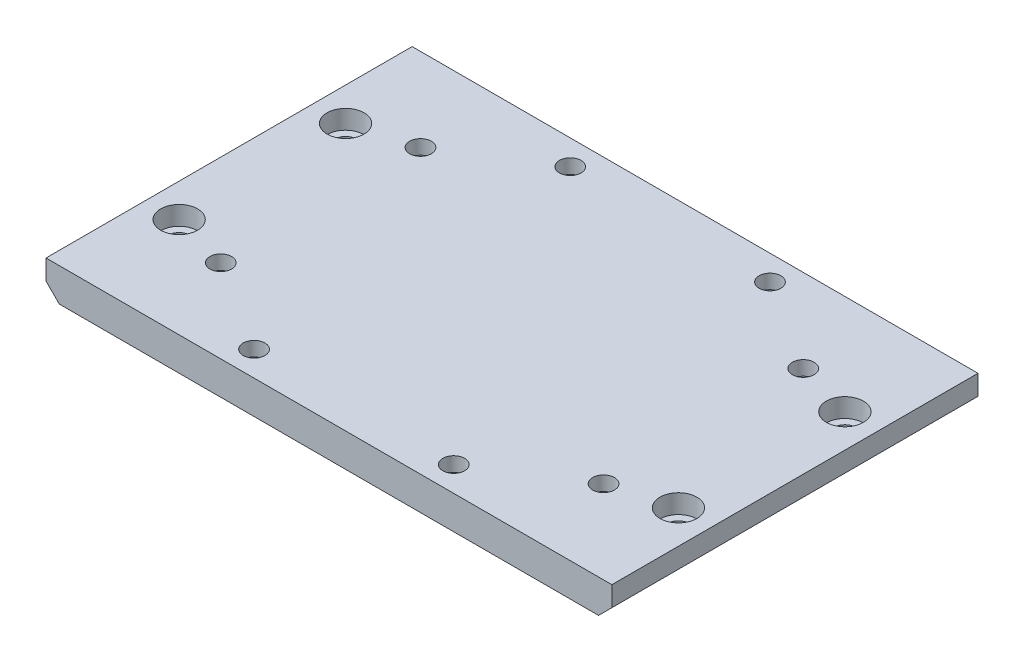
ISO-10303-21;
HEADER;
FILE_DESCRIPTION(('STEP AP214'),'2;1');
FILE_NAME('part.step','',(''),(''),'','','');
FILE_SCHEMA(('AUTOMOTIVE_DESIGN { 1 0 10303 214 1 1 1 1 }'));
ENDSEC;
DATA;
#1=APPLICATION_CONTEXT('core data for automotive mechanical design processes');
#2=APPLICATION_PROTOCOL_DEFINITION('international standard','automotive_design',2000,#1);
#3=PRODUCT_CONTEXT('',#1,'mechanical');
#4=PRODUCT('Part','Part','',(#3));
#5=PRODUCT_RELATED_PRODUCT_CATEGORY('part','',(#4));
#6=PRODUCT_DEFINITION_FORMATION('','',#4);
#7=PRODUCT_DEFINITION_CONTEXT('part definition',#1,'design');
#8=PRODUCT_DEFINITION('design','',#6,#7);
#9=PRODUCT_DEFINITION_SHAPE('','',#8);
#10=(LENGTH_UNIT() NAMED_UNIT(*) SI_UNIT(.MILLI.,.METRE.));
#11=(NAMED_UNIT(*) PLANE_ANGLE_UNIT() SI_UNIT($,.RADIAN.));
#12=(NAMED_UNIT(*) SI_UNIT($,.STERADIAN.) SOLID_ANGLE_UNIT());
#13=UNCERTAINTY_MEASURE_WITH_UNIT(LENGTH_MEASURE(1.E-05),#10,'distance_accuracy_value','');
#14=(GEOMETRIC_REPRESENTATION_CONTEXT(3) GLOBAL_UNCERTAINTY_ASSIGNED_CONTEXT((#13)) GLOBAL_UNIT_ASSIGNED_CONTEXT((#10,
#11,#12)) REPRESENTATION_CONTEXT('',''));
#15=CARTESIAN_POINT('',(0.,0.,0.));
#16=DIRECTION('',(0.,0.,1.));
#17=DIRECTION('',(1.,0.,0.));
#18=AXIS2_PLACEMENT_3D('',#15,#16,#17);
#19=CARTESIAN_POINT('',(27.5,5.,27.5));
#20=DIRECTION('',(0.,0.,-1.));
#21=DIRECTION('',(-1.,0.,0.));
#22=AXIS2_PLACEMENT_3D('',#19,#20,#21);
#23=PLANE('',#22);
#24=DIRECTION('',(0.,-1.,0.));
#25=VECTOR('',#24,1.);
#26=CARTESIAN_POINT('',(-42.5,62.0087712549569,27.5));
#27=LINE('',#26,#25);
#28=CARTESIAN_POINT('',(-42.5,5.,27.5));
#29=VERTEX_POINT('',#28);
#30=CARTESIAN_POINT('',(-42.5,2.,27.5));
#31=VERTEX_POINT('',#30);
#32=EDGE_CURVE('E124',#29,#31,#27,.T.);
#33=ORIENTED_EDGE('',*,*,#32,.T.);
#34=DIRECTION('',(0.707106781186548,-0.707106781186548,0.));
#35=VECTOR('',#34,1.);
#36=CARTESIAN_POINT('',(-40.5,0.,27.5));
#37=LINE('',#36,#35);
#38=CARTESIAN_POINT('',(-40.5,0.,27.5));
#39=VERTEX_POINT('',#38);
#40=EDGE_CURVE('E46',#31,#39,#37,.T.);
#41=ORIENTED_EDGE('',*,*,#40,.T.);
#42=DIRECTION('',(1.,0.,0.));
#43=VECTOR('',#42,1.);
#44=CARTESIAN_POINT('',(27.5,0.,27.5));
#45=LINE('',#44,#43);
#46=CARTESIAN_POINT('',(40.5,0.,27.5));
#47=VERTEX_POINT('',#46);
#48=EDGE_CURVE('E126',#39,#47,#45,.T.);
#49=ORIENTED_EDGE('',*,*,#48,.T.);
#50=DIRECTION('',(0.707106781186547,0.707106781186548,0.));
#51=VECTOR('',#50,1.);
#52=CARTESIAN_POINT('',(40.5,0.,27.5));
#53=LINE('',#52,#51);
#54=CARTESIAN_POINT('',(42.5,2.00000000000002,27.5));
#55=VERTEX_POINT('',#54);
#56=EDGE_CURVE('E53',#47,#55,#53,.T.);
#57=ORIENTED_EDGE('',*,*,#56,.T.);
#58=DIRECTION('',(0.,-1.,0.));
#59=VECTOR('',#58,1.);
#60=CARTESIAN_POINT('',(42.5,62.0087712549569,27.5));
#61=LINE('',#60,#59);
#62=CARTESIAN_POINT('',(42.5,5.,27.5));
#63=VERTEX_POINT('',#62);
#64=EDGE_CURVE('E111',#63,#55,#61,.T.);
#65=ORIENTED_EDGE('',*,*,#64,.F.);
#66=DIRECTION('',(1.,0.,0.));
#67=VECTOR('',#66,1.);
#68=CARTESIAN_POINT('',(27.5,5.,27.5));
#69=LINE('',#68,#67);
#70=EDGE_CURVE('E105',#29,#63,#69,.T.);
#71=ORIENTED_EDGE('',*,*,#70,.F.);
#72=EDGE_LOOP('',(#33,#41,#49,#57,#65,#71));
#73=FACE_BOUND('',#72,.T.);
#74=ADVANCED_FACE('F37',(#73),#23,.F.);
#75=CARTESIAN_POINT('',(27.5,5.,-27.5));
#76=DIRECTION('',(0.,0.,1.));
#77=DIRECTION('',(1.,0.,0.));
#78=AXIS2_PLACEMENT_3D('',#75,#76,#77);
#79=PLANE('',#78);
#80=DIRECTION('',(-1.,0.,0.));
#81=VECTOR('',#80,1.);
#82=CARTESIAN_POINT('',(27.5,0.,-27.5));
#83=LINE('',#82,#81);
#84=CARTESIAN_POINT('',(40.5,0.,-27.5));
#85=VERTEX_POINT('',#84);
#86=CARTESIAN_POINT('',(-40.5,0.,-27.5));
#87=VERTEX_POINT('',#86);
#88=EDGE_CURVE('E128',#85,#87,#83,.T.);
#89=ORIENTED_EDGE('',*,*,#88,.T.);
#90=DIRECTION('',(-0.707106781186548,0.707106781186548,0.));
#91=VECTOR('',#90,1.);
#92=CARTESIAN_POINT('',(-40.5,0.,-27.5));
#93=LINE('',#92,#91);
#94=CARTESIAN_POINT('',(-42.5,2.,-27.5));
#95=VERTEX_POINT('',#94);
#96=EDGE_CURVE('E139',#87,#95,#93,.T.);
#97=ORIENTED_EDGE('',*,*,#96,.T.);
#98=DIRECTION('',(0.,-1.,0.));
#99=VECTOR('',#98,1.);
#100=CARTESIAN_POINT('',(-42.5,62.0087712549569,-27.5));
#101=LINE('',#100,#99);
#102=CARTESIAN_POINT('',(-42.5,5.,-27.5));
#103=VERTEX_POINT('',#102);
#104=EDGE_CURVE('E100',#103,#95,#101,.T.);
#105=ORIENTED_EDGE('',*,*,#104,.F.);
#106=DIRECTION('',(-1.,0.,0.));
#107=VECTOR('',#106,1.);
#108=CARTESIAN_POINT('',(27.5,5.,-27.5));
#109=LINE('',#108,#107);
#110=CARTESIAN_POINT('',(42.5,5.,-27.5));
#111=VERTEX_POINT('',#110);
#112=EDGE_CURVE('E93',#111,#103,#109,.T.);
#113=ORIENTED_EDGE('',*,*,#112,.F.);
#114=DIRECTION('',(0.,-1.,0.));
#115=VECTOR('',#114,1.);
#116=CARTESIAN_POINT('',(42.5,62.0087712549569,-27.5));
#117=LINE('',#116,#115);
#118=CARTESIAN_POINT('',(42.5,2.00000000000002,-27.5));
#119=VERTEX_POINT('',#118);
#120=EDGE_CURVE('E98',#111,#119,#117,.T.);
#121=ORIENTED_EDGE('',*,*,#120,.T.);
#122=DIRECTION('',(-0.707106781186547,-0.707106781186548,0.));
#123=VECTOR('',#122,1.);
#124=CARTESIAN_POINT('',(40.5,0.,-27.5));
#125=LINE('',#124,#123);
#126=EDGE_CURVE('E137',#119,#85,#125,.T.);
#127=ORIENTED_EDGE('',*,*,#126,.T.);
#128=EDGE_LOOP('',(#89,#97,#105,#113,#121,#127));
#129=FACE_BOUND('',#128,.T.);
#130=ADVANCED_FACE('F96',(#129),#79,.F.);
#131=CARTESIAN_POINT('',(0.,5.,0.));
#132=DIRECTION('',(0.,1.,0.));
#133=DIRECTION('',(0.,0.,1.));
#134=AXIS2_PLACEMENT_3D('',#131,#132,#133);
#135=PLANE('',#134);
#136=CARTESIAN_POINT('',(28.75,5.,-15.));
#137=DIRECTION('',(0.,-1.,0.));
#138=DIRECTION('',(0.,0.,-1.));
#139=AXIS2_PLACEMENT_3D('',#136,#137,#138);
#140=CIRCLE('',#139,1.63195);
#141=CARTESIAN_POINT('',(28.75,5.,-16.63195));
#142=VERTEX_POINT('',#141);
#143=EDGE_CURVE('E459',#142,#142,#140,.T.);
#144=ORIENTED_EDGE('',*,*,#143,.T.);
#145=EDGE_LOOP('',(#144));
#146=FACE_BOUND('',#145,.T.);
#147=CARTESIAN_POINT('',(15.,5.,-23.75));
#148=DIRECTION('',(0.,-1.,0.));
#149=DIRECTION('',(0.,0.,-1.));
#150=AXIS2_PLACEMENT_3D('',#147,#148,#149);
#151=CIRCLE('',#150,1.63195);
#152=CARTESIAN_POINT('',(15.,5.,-25.38195));
#153=VERTEX_POINT('',#152);
#154=EDGE_CURVE('E447',#153,#153,#151,.T.);
#155=ORIENTED_EDGE('',*,*,#154,.T.);
#156=EDGE_LOOP('',(#155));
#157=FACE_BOUND('',#156,.T.);
#158=CARTESIAN_POINT('',(28.75,5.,15.));
#159=DIRECTION('',(0.,-1.,0.));
#160=DIRECTION('',(0.,0.,-1.));
#161=AXIS2_PLACEMENT_3D('',#158,#159,#160);
#162=CIRCLE('',#161,1.63195);
#163=CARTESIAN_POINT('',(28.75,5.,13.36805));
#164=VERTEX_POINT('',#163);
#165=EDGE_CURVE('E435',#164,#164,#162,.T.);
#166=ORIENTED_EDGE('',*,*,#165,.T.);
#167=EDGE_LOOP('',(#166));
#168=FACE_BOUND('',#167,.T.);
#169=CARTESIAN_POINT('',(15.,5.,23.75));
#170=DIRECTION('',(0.,-1.,0.));
#171=DIRECTION('',(0.,0.,-1.));
#172=AXIS2_PLACEMENT_3D('',#169,#170,#171);
#173=CIRCLE('',#172,1.63195);
#174=CARTESIAN_POINT('',(15.,5.,22.11805));
#175=VERTEX_POINT('',#174);
#176=EDGE_CURVE('E423',#175,#175,#173,.T.);
#177=ORIENTED_EDGE('',*,*,#176,.T.);
#178=EDGE_LOOP('',(#177));
#179=FACE_BOUND('',#178,.T.);
#180=CARTESIAN_POINT('',(-15.,5.,23.75));
#181=DIRECTION('',(0.,-1.,0.));
#182=DIRECTION('',(0.,0.,-1.));
#183=AXIS2_PLACEMENT_3D('',#180,#181,#182);
#184=CIRCLE('',#183,1.63195);
#185=CARTESIAN_POINT('',(-15.,5.,22.11805));
#186=VERTEX_POINT('',#185);
#187=EDGE_CURVE('E411',#186,#186,#184,.T.);
#188=ORIENTED_EDGE('',*,*,#187,.T.);
#189=EDGE_LOOP('',(#188));
#190=FACE_BOUND('',#189,.T.);
#191=CARTESIAN_POINT('',(-28.75,5.,15.));
#192=DIRECTION('',(0.,-1.,0.));
#193=DIRECTION('',(0.,0.,-1.));
#194=AXIS2_PLACEMENT_3D('',#191,#192,#193);
#195=CIRCLE('',#194,1.63195);
#196=CARTESIAN_POINT('',(-28.75,5.,13.36805));
#197=VERTEX_POINT('',#196);
#198=EDGE_CURVE('E399',#197,#197,#195,.T.);
#199=ORIENTED_EDGE('',*,*,#198,.T.);
#200=EDGE_LOOP('',(#199));
#201=FACE_BOUND('',#200,.T.);
#202=CARTESIAN_POINT('',(-28.75,5.,-15.));
#203=DIRECTION('',(0.,-1.,0.));
#204=DIRECTION('',(0.,0.,-1.));
#205=AXIS2_PLACEMENT_3D('',#202,#203,#204);
#206=CIRCLE('',#205,1.63195);
#207=CARTESIAN_POINT('',(-28.75,5.,-16.63195));
#208=VERTEX_POINT('',#207);
#209=EDGE_CURVE('E387',#208,#208,#206,.T.);
#210=ORIENTED_EDGE('',*,*,#209,.T.);
#211=EDGE_LOOP('',(#210));
#212=FACE_BOUND('',#211,.T.);
#213=CARTESIAN_POINT('',(-15.,5.,-23.75));
#214=DIRECTION('',(0.,-1.,0.));
#215=DIRECTION('',(0.,0.,-1.));
#216=AXIS2_PLACEMENT_3D('',#213,#214,#215);
#217=CIRCLE('',#216,1.63195);
#218=CARTESIAN_POINT('',(-15.,5.,-25.38195));
#219=VERTEX_POINT('',#218);
#220=EDGE_CURVE('E375',#219,#219,#217,.T.);
#221=ORIENTED_EDGE('',*,*,#220,.T.);
#222=EDGE_LOOP('',(#221));
#223=FACE_BOUND('',#222,.T.);
#224=CARTESIAN_POINT('',(-37.5,5.,-12.5));
#225=DIRECTION('',(0.,1.,0.));
#226=DIRECTION('',(0.,0.,1.));
#227=AXIS2_PLACEMENT_3D('',#224,#225,#226);
#228=CIRCLE('',#227,2.77875999999999);
#229=CARTESIAN_POINT('',(-37.5,5.,-9.72124));
#230=VERTEX_POINT('',#229);
#231=EDGE_CURVE('E372',#230,#230,#228,.T.);
#232=ORIENTED_EDGE('',*,*,#231,.F.);
#233=EDGE_LOOP('',(#232));
#234=FACE_BOUND('',#233,.T.);
#235=CARTESIAN_POINT('',(-37.5,5.,12.5));
#236=DIRECTION('',(0.,1.,0.));
#237=DIRECTION('',(0.,0.,1.));
#238=AXIS2_PLACEMENT_3D('',#235,#236,#237);
#239=CIRCLE('',#238,2.77875999999999);
#240=CARTESIAN_POINT('',(-37.5,5.,15.27876));
#241=VERTEX_POINT('',#240);
#242=EDGE_CURVE('E360',#241,#241,#239,.T.);
#243=ORIENTED_EDGE('',*,*,#242,.F.);
#244=EDGE_LOOP('',(#243));
#245=FACE_BOUND('',#244,.T.);
#246=CARTESIAN_POINT('',(37.5,5.,12.5));
#247=DIRECTION('',(0.,1.,0.));
#248=DIRECTION('',(0.,0.,1.));
#249=AXIS2_PLACEMENT_3D('',#246,#247,#248);
#250=CIRCLE('',#249,2.77875999999999);
#251=CARTESIAN_POINT('',(37.5,5.,15.27876));
#252=VERTEX_POINT('',#251);
#253=EDGE_CURVE('E348',#252,#252,#250,.T.);
#254=ORIENTED_EDGE('',*,*,#253,.F.);
#255=EDGE_LOOP('',(#254));
#256=FACE_BOUND('',#255,.T.);
#257=CARTESIAN_POINT('',(37.5,5.,-12.5));
#258=DIRECTION('',(0.,1.,0.));
#259=DIRECTION('',(0.,0.,1.));
#260=AXIS2_PLACEMENT_3D('',#257,#258,#259);
#261=CIRCLE('',#260,2.77875999999999);
#262=CARTESIAN_POINT('',(37.5,5.,-9.72124000000001));
#263=VERTEX_POINT('',#262);
#264=EDGE_CURVE('E334',#263,#263,#261,.T.);
#265=ORIENTED_EDGE('',*,*,#264,.F.);
#266=EDGE_LOOP('',(#265));
#267=FACE_BOUND('',#266,.T.);
#268=ORIENTED_EDGE('',*,*,#112,.T.);
#269=DIRECTION('',(0.,0.,-1.));
#270=VECTOR('',#269,1.);
#271=CARTESIAN_POINT('',(-42.5,5.,27.5));
#272=LINE('',#271,#270);
#273=EDGE_CURVE('E122',#29,#103,#272,.T.);
#274=ORIENTED_EDGE('',*,*,#273,.F.);
#275=ORIENTED_EDGE('',*,*,#70,.T.);
#276=DIRECTION('',(0.,0.,1.));
#277=VECTOR('',#276,1.);
#278=CARTESIAN_POINT('',(42.5,5.,27.5));
#279=LINE('',#278,#277);
#280=EDGE_CURVE('E108',#111,#63,#279,.T.);
#281=ORIENTED_EDGE('',*,*,#280,.F.);
#282=EDGE_LOOP('',(#268,#274,#275,#281));
#283=FACE_BOUND('',#282,.T.);
#284=ADVANCED_FACE('F109',(#146,#157,#168,#179,#190,#201,#212,#223,#234,#245,#256,#267,#283),
#135,.T.);
#285=CARTESIAN_POINT('',(0.,0.,0.));
#286=DIRECTION('',(0.,1.,0.));
#287=DIRECTION('',(0.,0.,1.));
#288=AXIS2_PLACEMENT_3D('',#285,#286,#287);
#289=PLANE('',#288);
#290=CARTESIAN_POINT('',(28.75,0.,-15.));
#291=DIRECTION('',(0.,-1.,0.));
#292=DIRECTION('',(0.,0.,-1.));
#293=AXIS2_PLACEMENT_3D('',#290,#291,#292);
#294=CIRCLE('',#293,2.77876);
#295=CARTESIAN_POINT('',(28.75,0.,-17.77876));
#296=VERTEX_POINT('',#295);
#297=EDGE_CURVE('E468',#296,#296,#294,.T.);
#298=ORIENTED_EDGE('',*,*,#297,.F.);
#299=EDGE_LOOP('',(#298));
#300=FACE_BOUND('',#299,.T.);
#301=CARTESIAN_POINT('',(15.,0.,-23.75));
#302=DIRECTION('',(0.,-1.,0.));
#303=DIRECTION('',(0.,0.,-1.));
#304=AXIS2_PLACEMENT_3D('',#301,#302,#303);
#305=CIRCLE('',#304,2.77876);
#306=CARTESIAN_POINT('',(15.,0.,-26.52876));
#307=VERTEX_POINT('',#306);
#308=EDGE_CURVE('E456',#307,#307,#305,.T.);
#309=ORIENTED_EDGE('',*,*,#308,.F.);
#310=EDGE_LOOP('',(#309));
#311=FACE_BOUND('',#310,.T.);
#312=CARTESIAN_POINT('',(28.75,0.,15.));
#313=DIRECTION('',(0.,-1.,0.));
#314=DIRECTION('',(0.,0.,-1.));
#315=AXIS2_PLACEMENT_3D('',#312,#313,#314);
#316=CIRCLE('',#315,2.77876);
#317=CARTESIAN_POINT('',(28.75,0.,12.22124));
#318=VERTEX_POINT('',#317);
#319=EDGE_CURVE('E444',#318,#318,#316,.T.);
#320=ORIENTED_EDGE('',*,*,#319,.F.);
#321=EDGE_LOOP('',(#320));
#322=FACE_BOUND('',#321,.T.);
#323=CARTESIAN_POINT('',(15.,0.,23.75));
#324=DIRECTION('',(0.,-1.,0.));
#325=DIRECTION('',(0.,0.,-1.));
#326=AXIS2_PLACEMENT_3D('',#323,#324,#325);
#327=CIRCLE('',#326,2.77876);
#328=CARTESIAN_POINT('',(15.,0.,20.97124));
#329=VERTEX_POINT('',#328);
#330=EDGE_CURVE('E432',#329,#329,#327,.T.);
#331=ORIENTED_EDGE('',*,*,#330,.F.);
#332=EDGE_LOOP('',(#331));
#333=FACE_BOUND('',#332,.T.);
#334=CARTESIAN_POINT('',(-15.,0.,23.75));
#335=DIRECTION('',(0.,-1.,0.));
#336=DIRECTION('',(0.,0.,-1.));
#337=AXIS2_PLACEMENT_3D('',#334,#335,#336);
#338=CIRCLE('',#337,2.77876);
#339=CARTESIAN_POINT('',(-15.,0.,20.97124));
#340=VERTEX_POINT('',#339);
#341=EDGE_CURVE('E420',#340,#340,#338,.T.);
#342=ORIENTED_EDGE('',*,*,#341,.F.);
#343=EDGE_LOOP('',(#342));
#344=FACE_BOUND('',#343,.T.);
#345=CARTESIAN_POINT('',(-28.75,0.,15.));
#346=DIRECTION('',(0.,-1.,0.));
#347=DIRECTION('',(0.,0.,-1.));
#348=AXIS2_PLACEMENT_3D('',#345,#346,#347);
#349=CIRCLE('',#348,2.77876);
#350=CARTESIAN_POINT('',(-28.75,0.,12.22124));
#351=VERTEX_POINT('',#350);
#352=EDGE_CURVE('E408',#351,#351,#349,.T.);
#353=ORIENTED_EDGE('',*,*,#352,.F.);
#354=EDGE_LOOP('',(#353));
#355=FACE_BOUND('',#354,.T.);
#356=CARTESIAN_POINT('',(-28.75,0.,-15.));
#357=DIRECTION('',(0.,-1.,0.));
#358=DIRECTION('',(0.,0.,-1.));
#359=AXIS2_PLACEMENT_3D('',#356,#357,#358);
#360=CIRCLE('',#359,2.77876);
#361=CARTESIAN_POINT('',(-28.75,0.,-17.77876));
#362=VERTEX_POINT('',#361);
#363=EDGE_CURVE('E396',#362,#362,#360,.T.);
#364=ORIENTED_EDGE('',*,*,#363,.F.);
#365=EDGE_LOOP('',(#364));
#366=FACE_BOUND('',#365,.T.);
#367=CARTESIAN_POINT('',(-15.,0.,-23.75));
#368=DIRECTION('',(0.,-1.,0.));
#369=DIRECTION('',(0.,0.,-1.));
#370=AXIS2_PLACEMENT_3D('',#367,#368,#369);
#371=CIRCLE('',#370,2.77876);
#372=CARTESIAN_POINT('',(-15.,0.,-26.52876));
#373=VERTEX_POINT('',#372);
#374=EDGE_CURVE('E384',#373,#373,#371,.T.);
#375=ORIENTED_EDGE('',*,*,#374,.F.);
#376=EDGE_LOOP('',(#375));
#377=FACE_BOUND('',#376,.T.);
#378=CARTESIAN_POINT('',(-37.5,0.,-12.5));
#379=DIRECTION('',(0.,1.,0.));
#380=DIRECTION('',(0.,0.,1.));
#381=AXIS2_PLACEMENT_3D('',#378,#379,#380);
#382=CIRCLE('',#381,1.63195000000001);
#383=CARTESIAN_POINT('',(-37.5,0.,-10.86805));
#384=VERTEX_POINT('',#383);
#385=EDGE_CURVE('E363',#384,#384,#382,.T.);
#386=ORIENTED_EDGE('',*,*,#385,.T.);
#387=EDGE_LOOP('',(#386));
#388=FACE_BOUND('',#387,.T.);
#389=CARTESIAN_POINT('',(-37.5,0.,12.5));
#390=DIRECTION('',(0.,1.,0.));
#391=DIRECTION('',(0.,0.,1.));
#392=AXIS2_PLACEMENT_3D('',#389,#390,#391);
#393=CIRCLE('',#392,1.63195000000001);
#394=CARTESIAN_POINT('',(-37.5,0.,14.13195));
#395=VERTEX_POINT('',#394);
#396=EDGE_CURVE('E351',#395,#395,#393,.T.);
#397=ORIENTED_EDGE('',*,*,#396,.T.);
#398=EDGE_LOOP('',(#397));
#399=FACE_BOUND('',#398,.T.);
#400=CARTESIAN_POINT('',(37.5,0.,12.5));
#401=DIRECTION('',(0.,1.,0.));
#402=DIRECTION('',(0.,0.,1.));
#403=AXIS2_PLACEMENT_3D('',#400,#401,#402);
#404=CIRCLE('',#403,1.63195000000001);
#405=CARTESIAN_POINT('',(37.5,0.,14.13195));
#406=VERTEX_POINT('',#405);
#407=EDGE_CURVE('E339',#406,#406,#404,.T.);
#408=ORIENTED_EDGE('',*,*,#407,.T.);
#409=EDGE_LOOP('',(#408));
#410=FACE_BOUND('',#409,.T.);
#411=CARTESIAN_POINT('',(37.5,0.,-12.5));
#412=DIRECTION('',(0.,1.,0.));
#413=DIRECTION('',(0.,0.,1.));
#414=AXIS2_PLACEMENT_3D('',#411,#412,#413);
#415=CIRCLE('',#414,1.63195000000001);
#416=CARTESIAN_POINT('',(37.5,0.,-10.86805));
#417=VERTEX_POINT('',#416);
#418=EDGE_CURVE('E115',#417,#417,#415,.T.);
#419=ORIENTED_EDGE('',*,*,#418,.T.);
#420=EDGE_LOOP('',(#419));
#421=FACE_BOUND('',#420,.T.);
#422=ORIENTED_EDGE('',*,*,#48,.F.);
#423=DIRECTION('',(0.,0.,-1.));
#424=VECTOR('',#423,1.);
#425=CARTESIAN_POINT('',(-40.5,0.,-27.5));
#426=LINE('',#425,#424);
#427=EDGE_CURVE('E134',#39,#87,#426,.T.);
#428=ORIENTED_EDGE('',*,*,#427,.T.);
#429=ORIENTED_EDGE('',*,*,#88,.F.);
#430=DIRECTION('',(0.,0.,1.));
#431=VECTOR('',#430,1.);
#432=CARTESIAN_POINT('',(40.5,0.,27.5));
#433=LINE('',#432,#431);
#434=EDGE_CURVE('E104',#85,#47,#433,.T.);
#435=ORIENTED_EDGE('',*,*,#434,.T.);
#436=EDGE_LOOP('',(#422,#428,#429,#435));
#437=FACE_BOUND('',#436,.T.);
#438=ADVANCED_FACE('F147',(#300,#311,#322,#333,#344,#355,#366,#377,#388,#399,#410,#421,#437),
#289,.F.);
#439=CARTESIAN_POINT('',(-42.5,62.0087712549569,27.5));
#440=DIRECTION('',(-1.,0.,0.));
#441=DIRECTION('',(0.,0.,1.));
#442=AXIS2_PLACEMENT_3D('',#439,#440,#441);
#443=PLANE('',#442);
#444=ORIENTED_EDGE('',*,*,#104,.T.);
#445=DIRECTION('',(0.,0.,1.));
#446=VECTOR('',#445,1.);
#447=CARTESIAN_POINT('',(-42.5,2.,27.5));
#448=LINE('',#447,#446);
#449=EDGE_CURVE('E61',#95,#31,#448,.T.);
#450=ORIENTED_EDGE('',*,*,#449,.T.);
#451=ORIENTED_EDGE('',*,*,#32,.F.);
#452=ORIENTED_EDGE('',*,*,#273,.T.);
#453=EDGE_LOOP('',(#444,#450,#451,#452));
#454=FACE_BOUND('',#453,.T.);
#455=ADVANCED_FACE('F151',(#454),#443,.T.);
#456=CARTESIAN_POINT('',(42.5,62.0087712549569,27.5));
#457=DIRECTION('',(1.,0.,0.));
#458=DIRECTION('',(0.,0.,-1.));
#459=AXIS2_PLACEMENT_3D('',#456,#457,#458);
#460=PLANE('',#459);
#461=ORIENTED_EDGE('',*,*,#64,.T.);
#462=DIRECTION('',(0.,0.,-1.));
#463=VECTOR('',#462,1.);
#464=CARTESIAN_POINT('',(42.5,2.00000000000002,-27.5));
#465=LINE('',#464,#463);
#466=EDGE_CURVE('E11',#55,#119,#465,.T.);
#467=ORIENTED_EDGE('',*,*,#466,.T.);
#468=ORIENTED_EDGE('',*,*,#120,.F.);
#469=ORIENTED_EDGE('',*,*,#280,.T.);
#470=EDGE_LOOP('',(#461,#467,#468,#469));
#471=FACE_BOUND('',#470,.T.);
#472=ADVANCED_FACE('F113',(#471),#460,.T.);
#473=CARTESIAN_POINT('',(37.5,5.,-12.5));
#474=DIRECTION('',(0.,1.,0.));
#475=DIRECTION('',(0.,0.,1.));
#476=AXIS2_PLACEMENT_3D('',#473,#474,#475);
#477=CYLINDRICAL_SURFACE('',#476,1.63195000000001);
#478=ORIENTED_EDGE('',*,*,#418,.F.);
#479=EDGE_LOOP('',(#478));
#480=FACE_BOUND('',#479,.T.);
#481=CARTESIAN_POINT('',(37.5,2.1552,-12.5));
#482=DIRECTION('',(0.,1.,0.));
#483=DIRECTION('',(0.,0.,1.));
#484=AXIS2_PLACEMENT_3D('',#481,#482,#483);
#485=CIRCLE('',#484,1.63195000000001);
#486=CARTESIAN_POINT('',(37.5,2.1552,-10.86805));
#487=VERTEX_POINT('',#486);
#488=EDGE_CURVE('E118',#487,#487,#485,.T.);
#489=ORIENTED_EDGE('',*,*,#488,.T.);
#490=EDGE_LOOP('',(#489));
#491=FACE_BOUND('',#490,.T.);
#492=ADVANCED_FACE('F158',(#480,#491),#477,.F.);
#493=CARTESIAN_POINT('',(39.13195,2.1552,-12.5));
#494=DIRECTION('',(0.,-1.,0.));
#495=DIRECTION('',(0.,0.,-1.));
#496=AXIS2_PLACEMENT_3D('',#493,#494,#495);
#497=PLANE('',#496);
#498=ORIENTED_EDGE('',*,*,#488,.F.);
#499=EDGE_LOOP('',(#498));
#500=FACE_BOUND('',#499,.T.);
#501=CARTESIAN_POINT('',(37.5,2.1552,-12.5));
#502=DIRECTION('',(0.,1.,0.));
#503=DIRECTION('',(0.,0.,1.));
#504=AXIS2_PLACEMENT_3D('',#501,#502,#503);
#505=CIRCLE('',#504,2.77875999999999);
#506=CARTESIAN_POINT('',(37.5,2.1552,-9.72124000000001));
#507=VERTEX_POINT('',#506);
#508=EDGE_CURVE('E331',#507,#507,#505,.T.);
#509=ORIENTED_EDGE('',*,*,#508,.T.);
#510=EDGE_LOOP('',(#509));
#511=FACE_BOUND('',#510,.T.);
#512=ADVANCED_FACE('F317',(#500,#511),#497,.F.);
#513=CARTESIAN_POINT('',(37.5,5.,-12.5));
#514=DIRECTION('',(0.,1.,0.));
#515=DIRECTION('',(0.,0.,1.));
#516=AXIS2_PLACEMENT_3D('',#513,#514,#515);
#517=CYLINDRICAL_SURFACE('',#516,2.77875999999999);
#518=ORIENTED_EDGE('',*,*,#508,.F.);
#519=EDGE_LOOP('',(#518));
#520=FACE_BOUND('',#519,.T.);
#521=ORIENTED_EDGE('',*,*,#264,.T.);
#522=EDGE_LOOP('',(#521));
#523=FACE_BOUND('',#522,.T.);
#524=ADVANCED_FACE('F313',(#520,#523),#517,.F.);
#525=CARTESIAN_POINT('',(37.5,5.,12.5));
#526=DIRECTION('',(0.,1.,0.));
#527=DIRECTION('',(0.,0.,1.));
#528=AXIS2_PLACEMENT_3D('',#525,#526,#527);
#529=CYLINDRICAL_SURFACE('',#528,1.63195000000001);
#530=ORIENTED_EDGE('',*,*,#407,.F.);
#531=EDGE_LOOP('',(#530));
#532=FACE_BOUND('',#531,.T.);
#533=CARTESIAN_POINT('',(37.5,2.1552,12.5));
#534=DIRECTION('',(0.,1.,0.));
#535=DIRECTION('',(0.,0.,1.));
#536=AXIS2_PLACEMENT_3D('',#533,#534,#535);
#537=CIRCLE('',#536,1.63195000000001);
#538=CARTESIAN_POINT('',(37.5,2.1552,14.13195));
#539=VERTEX_POINT('',#538);
#540=EDGE_CURVE('E342',#539,#539,#537,.T.);
#541=ORIENTED_EDGE('',*,*,#540,.T.);
#542=EDGE_LOOP('',(#541));
#543=FACE_BOUND('',#542,.T.);
#544=ADVANCED_FACE('F309',(#532,#543),#529,.F.);
#545=CARTESIAN_POINT('',(39.13195,2.1552,12.5));
#546=DIRECTION('',(0.,-1.,0.));
#547=DIRECTION('',(0.,0.,-1.));
#548=AXIS2_PLACEMENT_3D('',#545,#546,#547);
#549=PLANE('',#548);
#550=ORIENTED_EDGE('',*,*,#540,.F.);
#551=EDGE_LOOP('',(#550));
#552=FACE_BOUND('',#551,.T.);
#553=CARTESIAN_POINT('',(37.5,2.1552,12.5));
#554=DIRECTION('',(0.,1.,0.));
#555=DIRECTION('',(0.,0.,1.));
#556=AXIS2_PLACEMENT_3D('',#553,#554,#555);
#557=CIRCLE('',#556,2.77875999999999);
#558=CARTESIAN_POINT('',(37.5,2.1552,15.27876));
#559=VERTEX_POINT('',#558);
#560=EDGE_CURVE('E345',#559,#559,#557,.T.);
#561=ORIENTED_EDGE('',*,*,#560,.T.);
#562=EDGE_LOOP('',(#561));
#563=FACE_BOUND('',#562,.T.);
#564=ADVANCED_FACE('F305',(#552,#563),#549,.F.);
#565=CARTESIAN_POINT('',(37.5,5.,12.5));
#566=DIRECTION('',(0.,1.,0.));
#567=DIRECTION('',(0.,0.,1.));
#568=AXIS2_PLACEMENT_3D('',#565,#566,#567);
#569=CYLINDRICAL_SURFACE('',#568,2.77875999999999);
#570=ORIENTED_EDGE('',*,*,#560,.F.);
#571=EDGE_LOOP('',(#570));
#572=FACE_BOUND('',#571,.T.);
#573=ORIENTED_EDGE('',*,*,#253,.T.);
#574=EDGE_LOOP('',(#573));
#575=FACE_BOUND('',#574,.T.);
#576=ADVANCED_FACE('F301',(#572,#575),#569,.F.);
#577=CARTESIAN_POINT('',(-37.5,5.,12.5));
#578=DIRECTION('',(0.,1.,0.));
#579=DIRECTION('',(0.,0.,1.));
#580=AXIS2_PLACEMENT_3D('',#577,#578,#579);
#581=CYLINDRICAL_SURFACE('',#580,1.63195000000001);
#582=ORIENTED_EDGE('',*,*,#396,.F.);
#583=EDGE_LOOP('',(#582));
#584=FACE_BOUND('',#583,.T.);
#585=CARTESIAN_POINT('',(-37.5,2.1552,12.5));
#586=DIRECTION('',(0.,1.,0.));
#587=DIRECTION('',(0.,0.,1.));
#588=AXIS2_PLACEMENT_3D('',#585,#586,#587);
#589=CIRCLE('',#588,1.63195000000001);
#590=CARTESIAN_POINT('',(-37.5,2.1552,14.13195));
#591=VERTEX_POINT('',#590);
#592=EDGE_CURVE('E354',#591,#591,#589,.T.);
#593=ORIENTED_EDGE('',*,*,#592,.T.);
#594=EDGE_LOOP('',(#593));
#595=FACE_BOUND('',#594,.T.);
#596=ADVANCED_FACE('F297',(#584,#595),#581,.F.);
#597=CARTESIAN_POINT('',(-35.86805,2.1552,12.5));
#598=DIRECTION('',(0.,-1.,0.));
#599=DIRECTION('',(0.,0.,-1.));
#600=AXIS2_PLACEMENT_3D('',#597,#598,#599);
#601=PLANE('',#600);
#602=ORIENTED_EDGE('',*,*,#592,.F.);
#603=EDGE_LOOP('',(#602));
#604=FACE_BOUND('',#603,.T.);
#605=CARTESIAN_POINT('',(-37.5,2.1552,12.5));
#606=DIRECTION('',(0.,1.,0.));
#607=DIRECTION('',(0.,0.,1.));
#608=AXIS2_PLACEMENT_3D('',#605,#606,#607);
#609=CIRCLE('',#608,2.77875999999999);
#610=CARTESIAN_POINT('',(-37.5,2.1552,15.27876));
#611=VERTEX_POINT('',#610);
#612=EDGE_CURVE('E357',#611,#611,#609,.T.);
#613=ORIENTED_EDGE('',*,*,#612,.T.);
#614=EDGE_LOOP('',(#613));
#615=FACE_BOUND('',#614,.T.);
#616=ADVANCED_FACE('F293',(#604,#615),#601,.F.);
#617=CARTESIAN_POINT('',(-37.5,5.,12.5));
#618=DIRECTION('',(0.,1.,0.));
#619=DIRECTION('',(0.,0.,1.));
#620=AXIS2_PLACEMENT_3D('',#617,#618,#619);
#621=CYLINDRICAL_SURFACE('',#620,2.77875999999999);
#622=ORIENTED_EDGE('',*,*,#612,.F.);
#623=EDGE_LOOP('',(#622));
#624=FACE_BOUND('',#623,.T.);
#625=ORIENTED_EDGE('',*,*,#242,.T.);
#626=EDGE_LOOP('',(#625));
#627=FACE_BOUND('',#626,.T.);
#628=ADVANCED_FACE('F289',(#624,#627),#621,.F.);
#629=CARTESIAN_POINT('',(-37.5,5.,-12.5));
#630=DIRECTION('',(0.,1.,0.));
#631=DIRECTION('',(0.,0.,1.));
#632=AXIS2_PLACEMENT_3D('',#629,#630,#631);
#633=CYLINDRICAL_SURFACE('',#632,1.63195000000001);
#634=ORIENTED_EDGE('',*,*,#385,.F.);
#635=EDGE_LOOP('',(#634));
#636=FACE_BOUND('',#635,.T.);
#637=CARTESIAN_POINT('',(-37.5,2.1552,-12.5));
#638=DIRECTION('',(0.,1.,0.));
#639=DIRECTION('',(0.,0.,1.));
#640=AXIS2_PLACEMENT_3D('',#637,#638,#639);
#641=CIRCLE('',#640,1.63195000000001);
#642=CARTESIAN_POINT('',(-37.5,2.1552,-10.86805));
#643=VERTEX_POINT('',#642);
#644=EDGE_CURVE('E366',#643,#643,#641,.T.);
#645=ORIENTED_EDGE('',*,*,#644,.T.);
#646=EDGE_LOOP('',(#645));
#647=FACE_BOUND('',#646,.T.);
#648=ADVANCED_FACE('F285',(#636,#647),#633,.F.);
#649=CARTESIAN_POINT('',(-35.86805,2.1552,-12.5));
#650=DIRECTION('',(0.,-1.,0.));
#651=DIRECTION('',(0.,0.,-1.));
#652=AXIS2_PLACEMENT_3D('',#649,#650,#651);
#653=PLANE('',#652);
#654=ORIENTED_EDGE('',*,*,#644,.F.);
#655=EDGE_LOOP('',(#654));
#656=FACE_BOUND('',#655,.T.);
#657=CARTESIAN_POINT('',(-37.5,2.1552,-12.5));
#658=DIRECTION('',(0.,1.,0.));
#659=DIRECTION('',(0.,0.,1.));
#660=AXIS2_PLACEMENT_3D('',#657,#658,#659);
#661=CIRCLE('',#660,2.77875999999999);
#662=CARTESIAN_POINT('',(-37.5,2.1552,-9.72124));
#663=VERTEX_POINT('',#662);
#664=EDGE_CURVE('E369',#663,#663,#661,.T.);
#665=ORIENTED_EDGE('',*,*,#664,.T.);
#666=EDGE_LOOP('',(#665));
#667=FACE_BOUND('',#666,.T.);
#668=ADVANCED_FACE('F281',(#656,#667),#653,.F.);
#669=CARTESIAN_POINT('',(-37.5,5.,-12.5));
#670=DIRECTION('',(0.,1.,0.));
#671=DIRECTION('',(0.,0.,1.));
#672=AXIS2_PLACEMENT_3D('',#669,#670,#671);
#673=CYLINDRICAL_SURFACE('',#672,2.77875999999999);
#674=ORIENTED_EDGE('',*,*,#664,.F.);
#675=EDGE_LOOP('',(#674));
#676=FACE_BOUND('',#675,.T.);
#677=ORIENTED_EDGE('',*,*,#231,.T.);
#678=EDGE_LOOP('',(#677));
#679=FACE_BOUND('',#678,.T.);
#680=ADVANCED_FACE('F277',(#676,#679),#673,.F.);
#681=CARTESIAN_POINT('',(-15.,0.,-23.75));
#682=DIRECTION('',(0.,-1.,0.));
#683=DIRECTION('',(0.,0.,-1.));
#684=AXIS2_PLACEMENT_3D('',#681,#682,#683);
#685=CYLINDRICAL_SURFACE('',#684,1.63195);
#686=ORIENTED_EDGE('',*,*,#220,.F.);
#687=EDGE_LOOP('',(#686));
#688=FACE_BOUND('',#687,.T.);
#689=CARTESIAN_POINT('',(-15.,2.8448,-23.75));
#690=DIRECTION('',(0.,-1.,0.));
#691=DIRECTION('',(0.,0.,-1.));
#692=AXIS2_PLACEMENT_3D('',#689,#690,#691);
#693=CIRCLE('',#692,1.63195);
#694=CARTESIAN_POINT('',(-15.,2.8448,-25.38195));
#695=VERTEX_POINT('',#694);
#696=EDGE_CURVE('E378',#695,#695,#693,.T.);
#697=ORIENTED_EDGE('',*,*,#696,.T.);
#698=EDGE_LOOP('',(#697));
#699=FACE_BOUND('',#698,.T.);
#700=ADVANCED_FACE('F273',(#688,#699),#685,.F.);
#701=CARTESIAN_POINT('',(-13.36805,2.8448,-23.75));
#702=DIRECTION('',(0.,1.,0.));
#703=DIRECTION('',(0.,0.,1.));
#704=AXIS2_PLACEMENT_3D('',#701,#702,#703);
#705=PLANE('',#704);
#706=ORIENTED_EDGE('',*,*,#696,.F.);
#707=EDGE_LOOP('',(#706));
#708=FACE_BOUND('',#707,.T.);
#709=CARTESIAN_POINT('',(-15.,2.8448,-23.75));
#710=DIRECTION('',(0.,-1.,0.));
#711=DIRECTION('',(0.,0.,-1.));
#712=AXIS2_PLACEMENT_3D('',#709,#710,#711);
#713=CIRCLE('',#712,2.77876);
#714=CARTESIAN_POINT('',(-15.,2.8448,-26.52876));
#715=VERTEX_POINT('',#714);
#716=EDGE_CURVE('E381',#715,#715,#713,.T.);
#717=ORIENTED_EDGE('',*,*,#716,.T.);
#718=EDGE_LOOP('',(#717));
#719=FACE_BOUND('',#718,.T.);
#720=ADVANCED_FACE('F269',(#708,#719),#705,.F.);
#721=CARTESIAN_POINT('',(-15.,0.,-23.75));
#722=DIRECTION('',(0.,-1.,0.));
#723=DIRECTION('',(0.,0.,-1.));
#724=AXIS2_PLACEMENT_3D('',#721,#722,#723);
#725=CYLINDRICAL_SURFACE('',#724,2.77876);
#726=ORIENTED_EDGE('',*,*,#716,.F.);
#727=EDGE_LOOP('',(#726));
#728=FACE_BOUND('',#727,.T.);
#729=ORIENTED_EDGE('',*,*,#374,.T.);
#730=EDGE_LOOP('',(#729));
#731=FACE_BOUND('',#730,.T.);
#732=ADVANCED_FACE('F265',(#728,#731),#725,.F.);
#733=CARTESIAN_POINT('',(-28.75,0.,-15.));
#734=DIRECTION('',(0.,-1.,0.));
#735=DIRECTION('',(0.,0.,-1.));
#736=AXIS2_PLACEMENT_3D('',#733,#734,#735);
#737=CYLINDRICAL_SURFACE('',#736,1.63195);
#738=ORIENTED_EDGE('',*,*,#209,.F.);
#739=EDGE_LOOP('',(#738));
#740=FACE_BOUND('',#739,.T.);
#741=CARTESIAN_POINT('',(-28.75,2.8448,-15.));
#742=DIRECTION('',(0.,-1.,0.));
#743=DIRECTION('',(0.,0.,-1.));
#744=AXIS2_PLACEMENT_3D('',#741,#742,#743);
#745=CIRCLE('',#744,1.63195);
#746=CARTESIAN_POINT('',(-28.75,2.8448,-16.63195));
#747=VERTEX_POINT('',#746);
#748=EDGE_CURVE('E390',#747,#747,#745,.T.);
#749=ORIENTED_EDGE('',*,*,#748,.T.);
#750=EDGE_LOOP('',(#749));
#751=FACE_BOUND('',#750,.T.);
#752=ADVANCED_FACE('F261',(#740,#751),#737,.F.);
#753=CARTESIAN_POINT('',(-27.11805,2.8448,-15.));
#754=DIRECTION('',(0.,1.,0.));
#755=DIRECTION('',(0.,0.,1.));
#756=AXIS2_PLACEMENT_3D('',#753,#754,#755);
#757=PLANE('',#756);
#758=ORIENTED_EDGE('',*,*,#748,.F.);
#759=EDGE_LOOP('',(#758));
#760=FACE_BOUND('',#759,.T.);
#761=CARTESIAN_POINT('',(-28.75,2.8448,-15.));
#762=DIRECTION('',(0.,-1.,0.));
#763=DIRECTION('',(0.,0.,-1.));
#764=AXIS2_PLACEMENT_3D('',#761,#762,#763);
#765=CIRCLE('',#764,2.77876);
#766=CARTESIAN_POINT('',(-28.75,2.8448,-17.77876));
#767=VERTEX_POINT('',#766);
#768=EDGE_CURVE('E393',#767,#767,#765,.T.);
#769=ORIENTED_EDGE('',*,*,#768,.T.);
#770=EDGE_LOOP('',(#769));
#771=FACE_BOUND('',#770,.T.);
#772=ADVANCED_FACE('F257',(#760,#771),#757,.F.);
#773=CARTESIAN_POINT('',(-28.75,0.,-15.));
#774=DIRECTION('',(0.,-1.,0.));
#775=DIRECTION('',(0.,0.,-1.));
#776=AXIS2_PLACEMENT_3D('',#773,#774,#775);
#777=CYLINDRICAL_SURFACE('',#776,2.77876);
#778=ORIENTED_EDGE('',*,*,#768,.F.);
#779=EDGE_LOOP('',(#778));
#780=FACE_BOUND('',#779,.T.);
#781=ORIENTED_EDGE('',*,*,#363,.T.);
#782=EDGE_LOOP('',(#781));
#783=FACE_BOUND('',#782,.T.);
#784=ADVANCED_FACE('F253',(#780,#783),#777,.F.);
#785=CARTESIAN_POINT('',(-28.75,0.,15.));
#786=DIRECTION('',(0.,-1.,0.));
#787=DIRECTION('',(0.,0.,-1.));
#788=AXIS2_PLACEMENT_3D('',#785,#786,#787);
#789=CYLINDRICAL_SURFACE('',#788,1.63195);
#790=ORIENTED_EDGE('',*,*,#198,.F.);
#791=EDGE_LOOP('',(#790));
#792=FACE_BOUND('',#791,.T.);
#793=CARTESIAN_POINT('',(-28.75,2.8448,15.));
#794=DIRECTION('',(0.,-1.,0.));
#795=DIRECTION('',(0.,0.,-1.));
#796=AXIS2_PLACEMENT_3D('',#793,#794,#795);
#797=CIRCLE('',#796,1.63195);
#798=CARTESIAN_POINT('',(-28.75,2.8448,13.36805));
#799=VERTEX_POINT('',#798);
#800=EDGE_CURVE('E402',#799,#799,#797,.T.);
#801=ORIENTED_EDGE('',*,*,#800,.T.);
#802=EDGE_LOOP('',(#801));
#803=FACE_BOUND('',#802,.T.);
#804=ADVANCED_FACE('F249',(#792,#803),#789,.F.);
#805=CARTESIAN_POINT('',(-27.11805,2.8448,15.));
#806=DIRECTION('',(0.,1.,0.));
#807=DIRECTION('',(0.,0.,1.));
#808=AXIS2_PLACEMENT_3D('',#805,#806,#807);
#809=PLANE('',#808);
#810=ORIENTED_EDGE('',*,*,#800,.F.);
#811=EDGE_LOOP('',(#810));
#812=FACE_BOUND('',#811,.T.);
#813=CARTESIAN_POINT('',(-28.75,2.8448,15.));
#814=DIRECTION('',(0.,-1.,0.));
#815=DIRECTION('',(0.,0.,-1.));
#816=AXIS2_PLACEMENT_3D('',#813,#814,#815);
#817=CIRCLE('',#816,2.77876);
#818=CARTESIAN_POINT('',(-28.75,2.8448,12.22124));
#819=VERTEX_POINT('',#818);
#820=EDGE_CURVE('E405',#819,#819,#817,.T.);
#821=ORIENTED_EDGE('',*,*,#820,.T.);
#822=EDGE_LOOP('',(#821));
#823=FACE_BOUND('',#822,.T.);
#824=ADVANCED_FACE('F245',(#812,#823),#809,.F.);
#825=CARTESIAN_POINT('',(-28.75,0.,15.));
#826=DIRECTION('',(0.,-1.,0.));
#827=DIRECTION('',(0.,0.,-1.));
#828=AXIS2_PLACEMENT_3D('',#825,#826,#827);
#829=CYLINDRICAL_SURFACE('',#828,2.77876);
#830=ORIENTED_EDGE('',*,*,#820,.F.);
#831=EDGE_LOOP('',(#830));
#832=FACE_BOUND('',#831,.T.);
#833=ORIENTED_EDGE('',*,*,#352,.T.);
#834=EDGE_LOOP('',(#833));
#835=FACE_BOUND('',#834,.T.);
#836=ADVANCED_FACE('F241',(#832,#835),#829,.F.);
#837=CARTESIAN_POINT('',(-15.,0.,23.75));
#838=DIRECTION('',(0.,-1.,0.));
#839=DIRECTION('',(0.,0.,-1.));
#840=AXIS2_PLACEMENT_3D('',#837,#838,#839);
#841=CYLINDRICAL_SURFACE('',#840,1.63195);
#842=ORIENTED_EDGE('',*,*,#187,.F.);
#843=EDGE_LOOP('',(#842));
#844=FACE_BOUND('',#843,.T.);
#845=CARTESIAN_POINT('',(-15.,2.8448,23.75));
#846=DIRECTION('',(0.,-1.,0.));
#847=DIRECTION('',(0.,0.,-1.));
#848=AXIS2_PLACEMENT_3D('',#845,#846,#847);
#849=CIRCLE('',#848,1.63195);
#850=CARTESIAN_POINT('',(-15.,2.8448,22.11805));
#851=VERTEX_POINT('',#850);
#852=EDGE_CURVE('E414',#851,#851,#849,.T.);
#853=ORIENTED_EDGE('',*,*,#852,.T.);
#854=EDGE_LOOP('',(#853));
#855=FACE_BOUND('',#854,.T.);
#856=ADVANCED_FACE('F237',(#844,#855),#841,.F.);
#857=CARTESIAN_POINT('',(-13.36805,2.8448,23.75));
#858=DIRECTION('',(0.,1.,0.));
#859=DIRECTION('',(0.,0.,1.));
#860=AXIS2_PLACEMENT_3D('',#857,#858,#859);
#861=PLANE('',#860);
#862=ORIENTED_EDGE('',*,*,#852,.F.);
#863=EDGE_LOOP('',(#862));
#864=FACE_BOUND('',#863,.T.);
#865=CARTESIAN_POINT('',(-15.,2.8448,23.75));
#866=DIRECTION('',(0.,-1.,0.));
#867=DIRECTION('',(0.,0.,-1.));
#868=AXIS2_PLACEMENT_3D('',#865,#866,#867);
#869=CIRCLE('',#868,2.77876);
#870=CARTESIAN_POINT('',(-15.,2.8448,20.97124));
#871=VERTEX_POINT('',#870);
#872=EDGE_CURVE('E417',#871,#871,#869,.T.);
#873=ORIENTED_EDGE('',*,*,#872,.T.);
#874=EDGE_LOOP('',(#873));
#875=FACE_BOUND('',#874,.T.);
#876=ADVANCED_FACE('F233',(#864,#875),#861,.F.);
#877=CARTESIAN_POINT('',(-15.,0.,23.75));
#878=DIRECTION('',(0.,-1.,0.));
#879=DIRECTION('',(0.,0.,-1.));
#880=AXIS2_PLACEMENT_3D('',#877,#878,#879);
#881=CYLINDRICAL_SURFACE('',#880,2.77876);
#882=ORIENTED_EDGE('',*,*,#872,.F.);
#883=EDGE_LOOP('',(#882));
#884=FACE_BOUND('',#883,.T.);
#885=ORIENTED_EDGE('',*,*,#341,.T.);
#886=EDGE_LOOP('',(#885));
#887=FACE_BOUND('',#886,.T.);
#888=ADVANCED_FACE('F229',(#884,#887),#881,.F.);
#889=CARTESIAN_POINT('',(15.,0.,23.75));
#890=DIRECTION('',(0.,-1.,0.));
#891=DIRECTION('',(0.,0.,-1.));
#892=AXIS2_PLACEMENT_3D('',#889,#890,#891);
#893=CYLINDRICAL_SURFACE('',#892,1.63195);
#894=ORIENTED_EDGE('',*,*,#176,.F.);
#895=EDGE_LOOP('',(#894));
#896=FACE_BOUND('',#895,.T.);
#897=CARTESIAN_POINT('',(15.,2.8448,23.75));
#898=DIRECTION('',(0.,-1.,0.));
#899=DIRECTION('',(0.,0.,-1.));
#900=AXIS2_PLACEMENT_3D('',#897,#898,#899);
#901=CIRCLE('',#900,1.63195);
#902=CARTESIAN_POINT('',(15.,2.8448,22.11805));
#903=VERTEX_POINT('',#902);
#904=EDGE_CURVE('E426',#903,#903,#901,.T.);
#905=ORIENTED_EDGE('',*,*,#904,.T.);
#906=EDGE_LOOP('',(#905));
#907=FACE_BOUND('',#906,.T.);
#908=ADVANCED_FACE('F225',(#896,#907),#893,.F.);
#909=CARTESIAN_POINT('',(16.63195,2.8448,23.75));
#910=DIRECTION('',(0.,1.,0.));
#911=DIRECTION('',(0.,0.,1.));
#912=AXIS2_PLACEMENT_3D('',#909,#910,#911);
#913=PLANE('',#912);
#914=ORIENTED_EDGE('',*,*,#904,.F.);
#915=EDGE_LOOP('',(#914));
#916=FACE_BOUND('',#915,.T.);
#917=CARTESIAN_POINT('',(15.,2.8448,23.75));
#918=DIRECTION('',(0.,-1.,0.));
#919=DIRECTION('',(0.,0.,-1.));
#920=AXIS2_PLACEMENT_3D('',#917,#918,#919);
#921=CIRCLE('',#920,2.77876);
#922=CARTESIAN_POINT('',(15.,2.8448,20.97124));
#923=VERTEX_POINT('',#922);
#924=EDGE_CURVE('E429',#923,#923,#921,.T.);
#925=ORIENTED_EDGE('',*,*,#924,.T.);
#926=EDGE_LOOP('',(#925));
#927=FACE_BOUND('',#926,.T.);
#928=ADVANCED_FACE('F221',(#916,#927),#913,.F.);
#929=CARTESIAN_POINT('',(15.,0.,23.75));
#930=DIRECTION('',(0.,-1.,0.));
#931=DIRECTION('',(0.,0.,-1.));
#932=AXIS2_PLACEMENT_3D('',#929,#930,#931);
#933=CYLINDRICAL_SURFACE('',#932,2.77876);
#934=ORIENTED_EDGE('',*,*,#924,.F.);
#935=EDGE_LOOP('',(#934));
#936=FACE_BOUND('',#935,.T.);
#937=ORIENTED_EDGE('',*,*,#330,.T.);
#938=EDGE_LOOP('',(#937));
#939=FACE_BOUND('',#938,.T.);
#940=ADVANCED_FACE('F217',(#936,#939),#933,.F.);
#941=CARTESIAN_POINT('',(28.75,0.,15.));
#942=DIRECTION('',(0.,-1.,0.));
#943=DIRECTION('',(0.,0.,-1.));
#944=AXIS2_PLACEMENT_3D('',#941,#942,#943);
#945=CYLINDRICAL_SURFACE('',#944,1.63195);
#946=ORIENTED_EDGE('',*,*,#165,.F.);
#947=EDGE_LOOP('',(#946));
#948=FACE_BOUND('',#947,.T.);
#949=CARTESIAN_POINT('',(28.75,2.8448,15.));
#950=DIRECTION('',(0.,-1.,0.));
#951=DIRECTION('',(0.,0.,-1.));
#952=AXIS2_PLACEMENT_3D('',#949,#950,#951);
#953=CIRCLE('',#952,1.63195);
#954=CARTESIAN_POINT('',(28.75,2.8448,13.36805));
#955=VERTEX_POINT('',#954);
#956=EDGE_CURVE('E438',#955,#955,#953,.T.);
#957=ORIENTED_EDGE('',*,*,#956,.T.);
#958=EDGE_LOOP('',(#957));
#959=FACE_BOUND('',#958,.T.);
#960=ADVANCED_FACE('F213',(#948,#959),#945,.F.);
#961=CARTESIAN_POINT('',(30.38195,2.8448,15.));
#962=DIRECTION('',(0.,1.,0.));
#963=DIRECTION('',(0.,0.,1.));
#964=AXIS2_PLACEMENT_3D('',#961,#962,#963);
#965=PLANE('',#964);
#966=ORIENTED_EDGE('',*,*,#956,.F.);
#967=EDGE_LOOP('',(#966));
#968=FACE_BOUND('',#967,.T.);
#969=CARTESIAN_POINT('',(28.75,2.8448,15.));
#970=DIRECTION('',(0.,-1.,0.));
#971=DIRECTION('',(0.,0.,-1.));
#972=AXIS2_PLACEMENT_3D('',#969,#970,#971);
#973=CIRCLE('',#972,2.77876);
#974=CARTESIAN_POINT('',(28.75,2.8448,12.22124));
#975=VERTEX_POINT('',#974);
#976=EDGE_CURVE('E441',#975,#975,#973,.T.);
#977=ORIENTED_EDGE('',*,*,#976,.T.);
#978=EDGE_LOOP('',(#977));
#979=FACE_BOUND('',#978,.T.);
#980=ADVANCED_FACE('F209',(#968,#979),#965,.F.);
#981=CARTESIAN_POINT('',(28.75,0.,15.));
#982=DIRECTION('',(0.,-1.,0.));
#983=DIRECTION('',(0.,0.,-1.));
#984=AXIS2_PLACEMENT_3D('',#981,#982,#983);
#985=CYLINDRICAL_SURFACE('',#984,2.77876);
#986=ORIENTED_EDGE('',*,*,#976,.F.);
#987=EDGE_LOOP('',(#986));
#988=FACE_BOUND('',#987,.T.);
#989=ORIENTED_EDGE('',*,*,#319,.T.);
#990=EDGE_LOOP('',(#989));
#991=FACE_BOUND('',#990,.T.);
#992=ADVANCED_FACE('F205',(#988,#991),#985,.F.);
#993=CARTESIAN_POINT('',(15.,0.,-23.75));
#994=DIRECTION('',(0.,-1.,0.));
#995=DIRECTION('',(0.,0.,-1.));
#996=AXIS2_PLACEMENT_3D('',#993,#994,#995);
#997=CYLINDRICAL_SURFACE('',#996,1.63195);
#998=ORIENTED_EDGE('',*,*,#154,.F.);
#999=EDGE_LOOP('',(#998));
#1000=FACE_BOUND('',#999,.T.);
#1001=CARTESIAN_POINT('',(15.,2.8448,-23.75));
#1002=DIRECTION('',(0.,-1.,0.));
#1003=DIRECTION('',(0.,0.,-1.));
#1004=AXIS2_PLACEMENT_3D('',#1001,#1002,#1003);
#1005=CIRCLE('',#1004,1.63195);
#1006=CARTESIAN_POINT('',(15.,2.8448,-25.38195));
#1007=VERTEX_POINT('',#1006);
#1008=EDGE_CURVE('E450',#1007,#1007,#1005,.T.);
#1009=ORIENTED_EDGE('',*,*,#1008,.T.);
#1010=EDGE_LOOP('',(#1009));
#1011=FACE_BOUND('',#1010,.T.);
#1012=ADVANCED_FACE('F201',(#1000,#1011),#997,.F.);
#1013=CARTESIAN_POINT('',(16.63195,2.8448,-23.75));
#1014=DIRECTION('',(0.,1.,0.));
#1015=DIRECTION('',(0.,0.,1.));
#1016=AXIS2_PLACEMENT_3D('',#1013,#1014,#1015);
#1017=PLANE('',#1016);
#1018=ORIENTED_EDGE('',*,*,#1008,.F.);
#1019=EDGE_LOOP('',(#1018));
#1020=FACE_BOUND('',#1019,.T.);
#1021=CARTESIAN_POINT('',(15.,2.8448,-23.75));
#1022=DIRECTION('',(0.,-1.,0.));
#1023=DIRECTION('',(0.,0.,-1.));
#1024=AXIS2_PLACEMENT_3D('',#1021,#1022,#1023);
#1025=CIRCLE('',#1024,2.77876);
#1026=CARTESIAN_POINT('',(15.,2.8448,-26.52876));
#1027=VERTEX_POINT('',#1026);
#1028=EDGE_CURVE('E453',#1027,#1027,#1025,.T.);
#1029=ORIENTED_EDGE('',*,*,#1028,.T.);
#1030=EDGE_LOOP('',(#1029));
#1031=FACE_BOUND('',#1030,.T.);
#1032=ADVANCED_FACE('F197',(#1020,#1031),#1017,.F.);
#1033=CARTESIAN_POINT('',(15.,0.,-23.75));
#1034=DIRECTION('',(0.,-1.,0.));
#1035=DIRECTION('',(0.,0.,-1.));
#1036=AXIS2_PLACEMENT_3D('',#1033,#1034,#1035);
#1037=CYLINDRICAL_SURFACE('',#1036,2.77876);
#1038=ORIENTED_EDGE('',*,*,#1028,.F.);
#1039=EDGE_LOOP('',(#1038));
#1040=FACE_BOUND('',#1039,.T.);
#1041=ORIENTED_EDGE('',*,*,#308,.T.);
#1042=EDGE_LOOP('',(#1041));
#1043=FACE_BOUND('',#1042,.T.);
#1044=ADVANCED_FACE('F193',(#1040,#1043),#1037,.F.);
#1045=CARTESIAN_POINT('',(28.75,0.,-15.));
#1046=DIRECTION('',(0.,-1.,0.));
#1047=DIRECTION('',(0.,0.,-1.));
#1048=AXIS2_PLACEMENT_3D('',#1045,#1046,#1047);
#1049=CYLINDRICAL_SURFACE('',#1048,1.63195);
#1050=ORIENTED_EDGE('',*,*,#143,.F.);
#1051=EDGE_LOOP('',(#1050));
#1052=FACE_BOUND('',#1051,.T.);
#1053=CARTESIAN_POINT('',(28.75,2.8448,-15.));
#1054=DIRECTION('',(0.,-1.,0.));
#1055=DIRECTION('',(0.,0.,-1.));
#1056=AXIS2_PLACEMENT_3D('',#1053,#1054,#1055);
#1057=CIRCLE('',#1056,1.63195);
#1058=CARTESIAN_POINT('',(28.75,2.8448,-16.63195));
#1059=VERTEX_POINT('',#1058);
#1060=EDGE_CURVE('E462',#1059,#1059,#1057,.T.);
#1061=ORIENTED_EDGE('',*,*,#1060,.T.);
#1062=EDGE_LOOP('',(#1061));
#1063=FACE_BOUND('',#1062,.T.);
#1064=ADVANCED_FACE('F185',(#1052,#1063),#1049,.F.);
#1065=CARTESIAN_POINT('',(30.38195,2.8448,-15.));
#1066=DIRECTION('',(0.,1.,0.));
#1067=DIRECTION('',(0.,0.,1.));
#1068=AXIS2_PLACEMENT_3D('',#1065,#1066,#1067);
#1069=PLANE('',#1068);
#1070=ORIENTED_EDGE('',*,*,#1060,.F.);
#1071=EDGE_LOOP('',(#1070));
#1072=FACE_BOUND('',#1071,.T.);
#1073=CARTESIAN_POINT('',(28.75,2.8448,-15.));
#1074=DIRECTION('',(0.,-1.,0.));
#1075=DIRECTION('',(0.,0.,-1.));
#1076=AXIS2_PLACEMENT_3D('',#1073,#1074,#1075);
#1077=CIRCLE('',#1076,2.77876);
#1078=CARTESIAN_POINT('',(28.75,2.8448,-17.77876));
#1079=VERTEX_POINT('',#1078);
#1080=EDGE_CURVE('E465',#1079,#1079,#1077,.T.);
#1081=ORIENTED_EDGE('',*,*,#1080,.T.);
#1082=EDGE_LOOP('',(#1081));
#1083=FACE_BOUND('',#1082,.T.);
#1084=ADVANCED_FACE('F180',(#1072,#1083),#1069,.F.);
#1085=CARTESIAN_POINT('',(28.75,0.,-15.));
#1086=DIRECTION('',(0.,-1.,0.));
#1087=DIRECTION('',(0.,0.,-1.));
#1088=AXIS2_PLACEMENT_3D('',#1085,#1086,#1087);
#1089=CYLINDRICAL_SURFACE('',#1088,2.77876);
#1090=ORIENTED_EDGE('',*,*,#1080,.F.);
#1091=EDGE_LOOP('',(#1090));
#1092=FACE_BOUND('',#1091,.T.);
#1093=ORIENTED_EDGE('',*,*,#297,.T.);
#1094=EDGE_LOOP('',(#1093));
#1095=FACE_BOUND('',#1094,.T.);
#1096=ADVANCED_FACE('F174',(#1092,#1095),#1089,.F.);
#1097=CARTESIAN_POINT('',(-40.5,0.,0.));
#1098=DIRECTION('',(-0.707106781186547,-0.707106781186547,0.));
#1099=DIRECTION('',(0.,0.,1.));
#1100=AXIS2_PLACEMENT_3D('',#1097,#1098,#1099);
#1101=PLANE('',#1100);
#1102=ORIENTED_EDGE('',*,*,#40,.F.);
#1103=ORIENTED_EDGE('',*,*,#449,.F.);
#1104=ORIENTED_EDGE('',*,*,#96,.F.);
#1105=ORIENTED_EDGE('',*,*,#427,.F.);
#1106=EDGE_LOOP('',(#1102,#1103,#1104,#1105));
#1107=FACE_BOUND('',#1106,.T.);
#1108=ADVANCED_FACE('F150',(#1107),#1101,.T.);
#1109=CARTESIAN_POINT('',(40.5,0.,0.));
#1110=DIRECTION('',(0.707106781186548,-0.707106781186547,0.));
#1111=DIRECTION('',(0.,0.,-1.));
#1112=AXIS2_PLACEMENT_3D('',#1109,#1110,#1111);
#1113=PLANE('',#1112);
#1114=ORIENTED_EDGE('',*,*,#126,.F.);
#1115=ORIENTED_EDGE('',*,*,#466,.F.);
#1116=ORIENTED_EDGE('',*,*,#56,.F.);
#1117=ORIENTED_EDGE('',*,*,#434,.F.);
#1118=EDGE_LOOP('',(#1114,#1115,#1116,#1117));
#1119=FACE_BOUND('',#1118,.T.);
#1120=ADVANCED_FACE('F40',(#1119),#1113,.T.);
#1121=CLOSED_SHELL('',(#74,#130,#284,#438,#455,#472,#492,#512,#524,#544,#564,#576,#596,#616,
#628,#648,#668,#680,#700,#720,#732,#752,#772,#784,#804,#824,#836,#856,#876,#888,#908,#928,#940,
#960,#980,#992,#1012,#1032,#1044,#1064,#1084,#1096,#1108,#1120));
#1122=MANIFOLD_SOLID_BREP('B2',#1121);
#1123=ADVANCED_BREP_SHAPE_REPRESENTATION('',(#18,#1122),#14);
#1124=SHAPE_DEFINITION_REPRESENTATION(#9,#1123);
ENDSEC;
END-ISO-10303-21;
